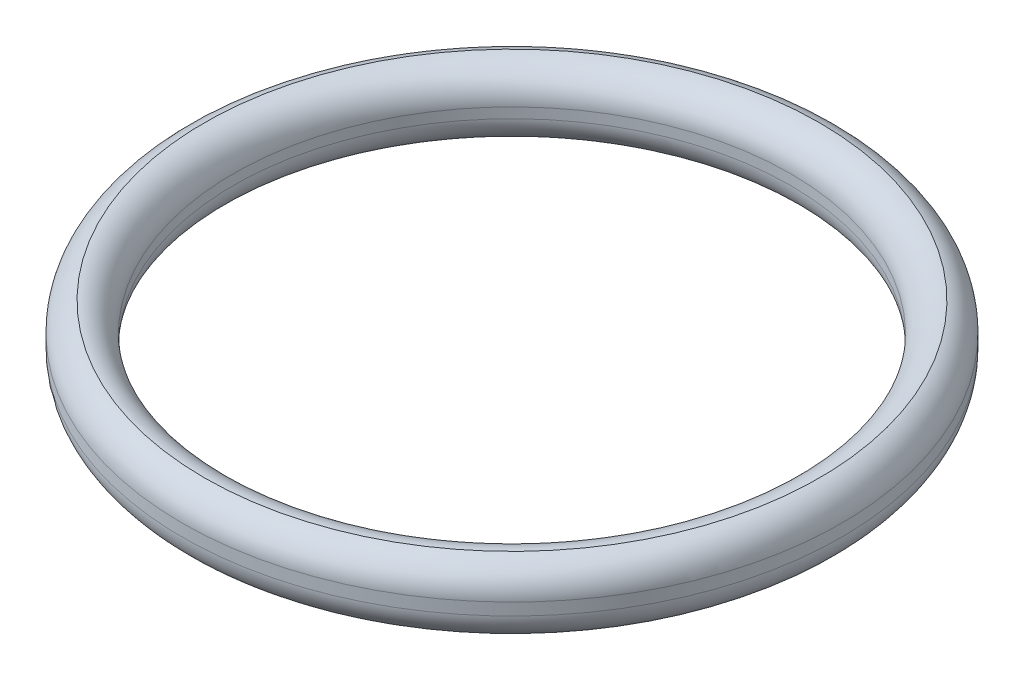
ISO-10303-21;
HEADER;
FILE_DESCRIPTION(('STEP AP214'),'2;1');
FILE_NAME('part.step','',(''),(''),'','','');
FILE_SCHEMA(('AUTOMOTIVE_DESIGN { 1 0 10303 214 1 1 1 1 }'));
ENDSEC;
DATA;
#1=APPLICATION_CONTEXT('core data for automotive mechanical design processes');
#2=APPLICATION_PROTOCOL_DEFINITION('international standard','automotive_design',2000,#1);
#3=PRODUCT_CONTEXT('',#1,'mechanical');
#4=PRODUCT('Part','Part','',(#3));
#5=PRODUCT_RELATED_PRODUCT_CATEGORY('part','',(#4));
#6=PRODUCT_DEFINITION_FORMATION('','',#4);
#7=PRODUCT_DEFINITION_CONTEXT('part definition',#1,'design');
#8=PRODUCT_DEFINITION('design','',#6,#7);
#9=PRODUCT_DEFINITION_SHAPE('','',#8);
#10=(LENGTH_UNIT() NAMED_UNIT(*) SI_UNIT(.MILLI.,.METRE.));
#11=(NAMED_UNIT(*) PLANE_ANGLE_UNIT() SI_UNIT($,.RADIAN.));
#12=(NAMED_UNIT(*) SI_UNIT($,.STERADIAN.) SOLID_ANGLE_UNIT());
#13=UNCERTAINTY_MEASURE_WITH_UNIT(LENGTH_MEASURE(1.E-05),#10,'distance_accuracy_value','');
#14=(GEOMETRIC_REPRESENTATION_CONTEXT(3) GLOBAL_UNCERTAINTY_ASSIGNED_CONTEXT((#13)) GLOBAL_UNIT_ASSIGNED_CONTEXT((#10,
#11,#12)) REPRESENTATION_CONTEXT('',''));
#15=CARTESIAN_POINT('',(0.,0.,0.));
#16=DIRECTION('',(0.,0.,1.));
#17=DIRECTION('',(1.,0.,0.));
#18=AXIS2_PLACEMENT_3D('',#15,#16,#17);
#19=CARTESIAN_POINT('',(0.,4.7,0.));
#20=DIRECTION('',(0.,-1.,0.));
#21=DIRECTION('',(0.,0.,-1.));
#22=AXIS2_PLACEMENT_3D('',#19,#20,#21);
#23=CYLINDRICAL_SURFACE('',#22,22.5);
#24=CARTESIAN_POINT('',(0.,1.93649167310371,0.));
#25=DIRECTION('',(0.,-1.,0.));
#26=DIRECTION('',(0.,0.,-1.));
#27=AXIS2_PLACEMENT_3D('',#24,#25,#26);
#28=CIRCLE('',#27,22.5);
#29=CARTESIAN_POINT('',(0.,1.93649167310371,-22.5));
#30=VERTEX_POINT('',#29);
#31=EDGE_CURVE('E10',#30,#30,#28,.F.);
#32=ORIENTED_EDGE('',*,*,#31,.T.);
#33=EDGE_LOOP('',(#32));
#34=FACE_BOUND('',#33,.T.);
#35=CARTESIAN_POINT('',(0.,2.76350832689629,0.));
#36=DIRECTION('',(0.,1.,0.));
#37=DIRECTION('',(0.,0.,1.));
#38=AXIS2_PLACEMENT_3D('',#35,#36,#37);
#39=CIRCLE('',#38,22.5);
#40=CARTESIAN_POINT('',(0.,2.76350832689629,22.5));
#41=VERTEX_POINT('',#40);
#42=EDGE_CURVE('E51',#41,#41,#39,.F.);
#43=ORIENTED_EDGE('',*,*,#42,.T.);
#44=EDGE_LOOP('',(#43));
#45=FACE_BOUND('',#44,.T.);
#46=ADVANCED_FACE('F43',(#34,#45),#23,.T.);
#47=CARTESIAN_POINT('',(0.,4.7,0.));
#48=DIRECTION('',(0.,-1.,0.));
#49=DIRECTION('',(0.,0.,-1.));
#50=AXIS2_PLACEMENT_3D('',#47,#48,#49);
#51=CYLINDRICAL_SURFACE('',#50,19.);
#52=CARTESIAN_POINT('',(0.,2.,0.));
#53=DIRECTION('',(0.,1.,0.));
#54=DIRECTION('',(0.,0.,1.));
#55=AXIS2_PLACEMENT_3D('',#52,#53,#54);
#56=CIRCLE('',#55,19.);
#57=CARTESIAN_POINT('',(0.,2.,19.));
#58=VERTEX_POINT('',#57);
#59=EDGE_CURVE('E61',#58,#58,#56,.F.);
#60=ORIENTED_EDGE('',*,*,#59,.T.);
#61=EDGE_LOOP('',(#60));
#62=FACE_BOUND('',#61,.T.);
#63=CARTESIAN_POINT('',(0.,2.7,0.));
#64=DIRECTION('',(0.,1.,0.));
#65=DIRECTION('',(0.,0.,1.));
#66=AXIS2_PLACEMENT_3D('',#63,#64,#65);
#67=CIRCLE('',#66,19.);
#68=CARTESIAN_POINT('',(0.,2.7,19.));
#69=VERTEX_POINT('',#68);
#70=EDGE_CURVE('E67',#69,#69,#67,.T.);
#71=ORIENTED_EDGE('',*,*,#70,.T.);
#72=EDGE_LOOP('',(#71));
#73=FACE_BOUND('',#72,.T.);
#74=ADVANCED_FACE('F82',(#62,#73),#51,.F.);
#75=CARTESIAN_POINT('',(0.,2.,0.));
#76=DIRECTION('',(0.,1.,0.));
#77=DIRECTION('',(0.,0.,1.));
#78=AXIS2_PLACEMENT_3D('',#75,#76,#77);
#79=TOROIDAL_SURFACE('',#78,21.,2.);
#80=ORIENTED_EDGE('',*,*,#59,.F.);
#81=EDGE_LOOP('',(#80));
#82=FACE_BOUND('',#81,.T.);
#83=CARTESIAN_POINT('',(0.,0.,0.));
#84=DIRECTION('',(0.,1.,0.));
#85=DIRECTION('',(0.,0.,1.));
#86=AXIS2_PLACEMENT_3D('',#83,#84,#85);
#87=CIRCLE('',#86,21.);
#88=CARTESIAN_POINT('',(0.,0.,21.));
#89=VERTEX_POINT('',#88);
#90=EDGE_CURVE('E71',#89,#89,#87,.T.);
#91=ORIENTED_EDGE('',*,*,#90,.F.);
#92=EDGE_LOOP('',(#91));
#93=FACE_BOUND('',#92,.T.);
#94=ADVANCED_FACE('F79',(#82,#93),#79,.T.);
#95=CARTESIAN_POINT('',(0.,2.7,0.));
#96=DIRECTION('',(0.,1.,0.));
#97=DIRECTION('',(0.,0.,1.));
#98=AXIS2_PLACEMENT_3D('',#95,#96,#97);
#99=TOROIDAL_SURFACE('',#98,21.,2.);
#100=CARTESIAN_POINT('',(0.,4.7,0.));
#101=DIRECTION('',(0.,1.,0.));
#102=DIRECTION('',(0.,0.,1.));
#103=AXIS2_PLACEMENT_3D('',#100,#101,#102);
#104=CIRCLE('',#103,21.);
#105=CARTESIAN_POINT('',(0.,4.7,21.));
#106=VERTEX_POINT('',#105);
#107=EDGE_CURVE('E56',#106,#106,#104,.F.);
#108=ORIENTED_EDGE('',*,*,#107,.F.);
#109=EDGE_LOOP('',(#108));
#110=FACE_BOUND('',#109,.T.);
#111=ORIENTED_EDGE('',*,*,#70,.F.);
#112=EDGE_LOOP('',(#111));
#113=FACE_BOUND('',#112,.T.);
#114=ADVANCED_FACE('F81',(#110,#113),#99,.T.);
#115=CARTESIAN_POINT('',(0.,1.93649167310371,0.));
#116=DIRECTION('',(0.,-1.,0.));
#117=DIRECTION('',(0.,0.,-1.));
#118=AXIS2_PLACEMENT_3D('',#115,#116,#117);
#119=TOROIDAL_SURFACE('',#118,20.5,2.);
#120=ORIENTED_EDGE('',*,*,#90,.T.);
#121=EDGE_LOOP('',(#120));
#122=FACE_BOUND('',#121,.T.);
#123=ORIENTED_EDGE('',*,*,#31,.F.);
#124=EDGE_LOOP('',(#123));
#125=FACE_BOUND('',#124,.T.);
#126=ADVANCED_FACE('F76',(#122,#125),#119,.T.);
#127=CARTESIAN_POINT('',(0.,2.76350832689629,0.));
#128=DIRECTION('',(0.,1.,0.));
#129=DIRECTION('',(0.,0.,1.));
#130=AXIS2_PLACEMENT_3D('',#127,#128,#129);
#131=TOROIDAL_SURFACE('',#130,20.5,2.);
#132=ORIENTED_EDGE('',*,*,#42,.F.);
#133=EDGE_LOOP('',(#132));
#134=FACE_BOUND('',#133,.T.);
#135=ORIENTED_EDGE('',*,*,#107,.T.);
#136=EDGE_LOOP('',(#135));
#137=FACE_BOUND('',#136,.T.);
#138=ADVANCED_FACE('F45',(#134,#137),#131,.T.);
#139=CLOSED_SHELL('',(#46,#74,#94,#114,#126,#138));
#140=MANIFOLD_SOLID_BREP('B2',#139);
#141=ADVANCED_BREP_SHAPE_REPRESENTATION('',(#18,#140),#14);
#142=SHAPE_DEFINITION_REPRESENTATION(#9,#141);
ENDSEC;
END-ISO-10303-21;
